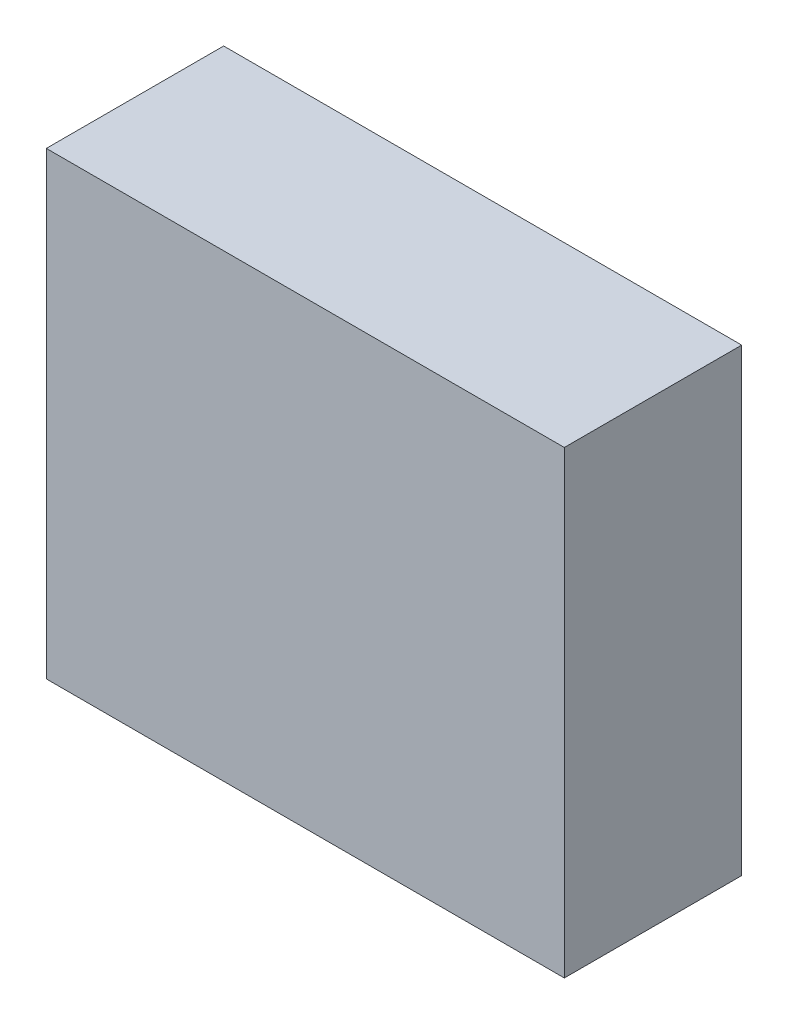
ISO-10303-21;
HEADER;
FILE_DESCRIPTION(('STEP AP214'),'2;1');
FILE_NAME('part.step','',(''),(''),'','','');
FILE_SCHEMA(('AUTOMOTIVE_DESIGN { 1 0 10303 214 1 1 1 1 }'));
ENDSEC;
DATA;
#1=APPLICATION_CONTEXT('core data for automotive mechanical design processes');
#2=APPLICATION_PROTOCOL_DEFINITION('international standard','automotive_design',2000,#1);
#3=PRODUCT_CONTEXT('',#1,'mechanical');
#4=PRODUCT('Part','Part','',(#3));
#5=PRODUCT_RELATED_PRODUCT_CATEGORY('part','',(#4));
#6=PRODUCT_DEFINITION_FORMATION('','',#4);
#7=PRODUCT_DEFINITION_CONTEXT('part definition',#1,'design');
#8=PRODUCT_DEFINITION('design','',#6,#7);
#9=PRODUCT_DEFINITION_SHAPE('','',#8);
#10=(LENGTH_UNIT() NAMED_UNIT(*) SI_UNIT(.MILLI.,.METRE.));
#11=(NAMED_UNIT(*) PLANE_ANGLE_UNIT() SI_UNIT($,.RADIAN.));
#12=(NAMED_UNIT(*) SI_UNIT($,.STERADIAN.) SOLID_ANGLE_UNIT());
#13=UNCERTAINTY_MEASURE_WITH_UNIT(LENGTH_MEASURE(1.E-05),#10,'distance_accuracy_value','');
#14=(GEOMETRIC_REPRESENTATION_CONTEXT(3) GLOBAL_UNCERTAINTY_ASSIGNED_CONTEXT((#13)) GLOBAL_UNIT_ASSIGNED_CONTEXT((#10,
#11,#12)) REPRESENTATION_CONTEXT('',''));
#15=CARTESIAN_POINT('',(0.,0.,0.));
#16=DIRECTION('',(0.,0.,1.));
#17=DIRECTION('',(1.,0.,0.));
#18=AXIS2_PLACEMENT_3D('',#15,#16,#17);
#19=CARTESIAN_POINT('',(-1.4224,-1.2954,1.));
#20=DIRECTION('',(1.,0.,0.));
#21=DIRECTION('',(0.,0.,-1.));
#22=AXIS2_PLACEMENT_3D('',#19,#20,#21);
#23=PLANE('',#22);
#24=DIRECTION('',(0.,-1.,0.));
#25=VECTOR('',#24,1.);
#26=CARTESIAN_POINT('',(-1.4224,-1.2954,0.));
#27=LINE('',#26,#25);
#28=CARTESIAN_POINT('',(-1.4224,1.2954,0.));
#29=VERTEX_POINT('',#28);
#30=CARTESIAN_POINT('',(-1.4224,-1.2954,0.));
#31=VERTEX_POINT('',#30);
#32=EDGE_CURVE('E96',#29,#31,#27,.T.);
#33=ORIENTED_EDGE('',*,*,#32,.T.);
#34=DIRECTION('',(0.,0.,-1.));
#35=VECTOR('',#34,1.);
#36=CARTESIAN_POINT('',(-1.4224,-1.2954,1.));
#37=LINE('',#36,#35);
#38=CARTESIAN_POINT('',(-1.4224,-1.2954,1.));
#39=VERTEX_POINT('',#38);
#40=EDGE_CURVE('E11',#39,#31,#37,.T.);
#41=ORIENTED_EDGE('',*,*,#40,.F.);
#42=DIRECTION('',(0.,-1.,0.));
#43=VECTOR('',#42,1.);
#44=CARTESIAN_POINT('',(-1.4224,-1.2954,1.));
#45=LINE('',#44,#43);
#46=CARTESIAN_POINT('',(-1.4224,1.2954,1.));
#47=VERTEX_POINT('',#46);
#48=EDGE_CURVE('E84',#47,#39,#45,.T.);
#49=ORIENTED_EDGE('',*,*,#48,.F.);
#50=DIRECTION('',(0.,0.,-1.));
#51=VECTOR('',#50,1.);
#52=CARTESIAN_POINT('',(-1.4224,1.2954,1.));
#53=LINE('',#52,#51);
#54=EDGE_CURVE('E92',#47,#29,#53,.T.);
#55=ORIENTED_EDGE('',*,*,#54,.T.);
#56=EDGE_LOOP('',(#33,#41,#49,#55));
#57=FACE_BOUND('',#56,.T.);
#58=ADVANCED_FACE('F33',(#57),#23,.F.);
#59=CARTESIAN_POINT('',(1.4986,-1.2954,1.));
#60=DIRECTION('',(0.,1.,0.));
#61=DIRECTION('',(0.,0.,1.));
#62=AXIS2_PLACEMENT_3D('',#59,#60,#61);
#63=PLANE('',#62);
#64=DIRECTION('',(1.,0.,0.));
#65=VECTOR('',#64,1.);
#66=CARTESIAN_POINT('',(1.4986,-1.2954,0.));
#67=LINE('',#66,#65);
#68=CARTESIAN_POINT('',(1.4986,-1.2954,0.));
#69=VERTEX_POINT('',#68);
#70=EDGE_CURVE('E88',#31,#69,#67,.T.);
#71=ORIENTED_EDGE('',*,*,#70,.T.);
#72=DIRECTION('',(0.,0.,-1.));
#73=VECTOR('',#72,1.);
#74=CARTESIAN_POINT('',(1.4986,-1.2954,1.));
#75=LINE('',#74,#73);
#76=CARTESIAN_POINT('',(1.4986,-1.2954,1.));
#77=VERTEX_POINT('',#76);
#78=EDGE_CURVE('E41',#77,#69,#75,.T.);
#79=ORIENTED_EDGE('',*,*,#78,.F.);
#80=DIRECTION('',(1.,0.,0.));
#81=VECTOR('',#80,1.);
#82=CARTESIAN_POINT('',(1.4986,-1.2954,1.));
#83=LINE('',#82,#81);
#84=EDGE_CURVE('E79',#39,#77,#83,.T.);
#85=ORIENTED_EDGE('',*,*,#84,.F.);
#86=ORIENTED_EDGE('',*,*,#40,.T.);
#87=EDGE_LOOP('',(#71,#79,#85,#86));
#88=FACE_BOUND('',#87,.T.);
#89=ADVANCED_FACE('F87',(#88),#63,.F.);
#90=CARTESIAN_POINT('',(1.4986,1.2954,1.));
#91=DIRECTION('',(-1.,0.,0.));
#92=DIRECTION('',(0.,0.,1.));
#93=AXIS2_PLACEMENT_3D('',#90,#91,#92);
#94=PLANE('',#93);
#95=DIRECTION('',(0.,1.,0.));
#96=VECTOR('',#95,1.);
#97=CARTESIAN_POINT('',(1.4986,1.2954,0.));
#98=LINE('',#97,#96);
#99=CARTESIAN_POINT('',(1.4986,1.2954,0.));
#100=VERTEX_POINT('',#99);
#101=EDGE_CURVE('E66',#69,#100,#98,.T.);
#102=ORIENTED_EDGE('',*,*,#101,.T.);
#103=DIRECTION('',(0.,0.,-1.));
#104=VECTOR('',#103,1.);
#105=CARTESIAN_POINT('',(1.4986,1.2954,1.));
#106=LINE('',#105,#104);
#107=CARTESIAN_POINT('',(1.4986,1.2954,1.));
#108=VERTEX_POINT('',#107);
#109=EDGE_CURVE('E89',#108,#100,#106,.T.);
#110=ORIENTED_EDGE('',*,*,#109,.F.);
#111=DIRECTION('',(0.,1.,0.));
#112=VECTOR('',#111,1.);
#113=CARTESIAN_POINT('',(1.4986,1.2954,1.));
#114=LINE('',#113,#112);
#115=EDGE_CURVE('E82',#77,#108,#114,.T.);
#116=ORIENTED_EDGE('',*,*,#115,.F.);
#117=ORIENTED_EDGE('',*,*,#78,.T.);
#118=EDGE_LOOP('',(#102,#110,#116,#117));
#119=FACE_BOUND('',#118,.T.);
#120=ADVANCED_FACE('F90',(#119),#94,.F.);
#121=CARTESIAN_POINT('',(-1.4224,1.2954,1.));
#122=DIRECTION('',(0.,-1.,0.));
#123=DIRECTION('',(0.,0.,-1.));
#124=AXIS2_PLACEMENT_3D('',#121,#122,#123);
#125=PLANE('',#124);
#126=DIRECTION('',(-1.,0.,0.));
#127=VECTOR('',#126,1.);
#128=CARTESIAN_POINT('',(-1.4224,1.2954,0.));
#129=LINE('',#128,#127);
#130=EDGE_CURVE('E72',#100,#29,#129,.T.);
#131=ORIENTED_EDGE('',*,*,#130,.T.);
#132=ORIENTED_EDGE('',*,*,#54,.F.);
#133=DIRECTION('',(-1.,0.,0.));
#134=VECTOR('',#133,1.);
#135=CARTESIAN_POINT('',(-1.4224,1.2954,1.));
#136=LINE('',#135,#134);
#137=EDGE_CURVE('E49',#108,#47,#136,.T.);
#138=ORIENTED_EDGE('',*,*,#137,.F.);
#139=ORIENTED_EDGE('',*,*,#109,.T.);
#140=EDGE_LOOP('',(#131,#132,#138,#139));
#141=FACE_BOUND('',#140,.T.);
#142=ADVANCED_FACE('F103',(#141),#125,.F.);
#143=CARTESIAN_POINT('',(0.,0.,1.));
#144=DIRECTION('',(0.,0.,-1.));
#145=DIRECTION('',(-1.,0.,0.));
#146=AXIS2_PLACEMENT_3D('',#143,#144,#145);
#147=PLANE('',#146);
#148=ORIENTED_EDGE('',*,*,#48,.T.);
#149=ORIENTED_EDGE('',*,*,#84,.T.);
#150=ORIENTED_EDGE('',*,*,#115,.T.);
#151=ORIENTED_EDGE('',*,*,#137,.T.);
#152=EDGE_LOOP('',(#148,#149,#150,#151));
#153=FACE_BOUND('',#152,.T.);
#154=ADVANCED_FACE('F80',(#153),#147,.F.);
#155=CARTESIAN_POINT('',(0.,0.,0.));
#156=DIRECTION('',(0.,0.,-1.));
#157=DIRECTION('',(-1.,0.,0.));
#158=AXIS2_PLACEMENT_3D('',#155,#156,#157);
#159=PLANE('',#158);
#160=ORIENTED_EDGE('',*,*,#32,.F.);
#161=ORIENTED_EDGE('',*,*,#130,.F.);
#162=ORIENTED_EDGE('',*,*,#101,.F.);
#163=ORIENTED_EDGE('',*,*,#70,.F.);
#164=EDGE_LOOP('',(#160,#161,#162,#163));
#165=FACE_BOUND('',#164,.T.);
#166=ADVANCED_FACE('F106',(#165),#159,.T.);
#167=CLOSED_SHELL('',(#58,#89,#120,#142,#154,#166));
#168=MANIFOLD_SOLID_BREP('B2',#167);
#169=ADVANCED_BREP_SHAPE_REPRESENTATION('',(#18,#168),#14);
#170=SHAPE_DEFINITION_REPRESENTATION(#9,#169);
ENDSEC;
END-ISO-10303-21;
